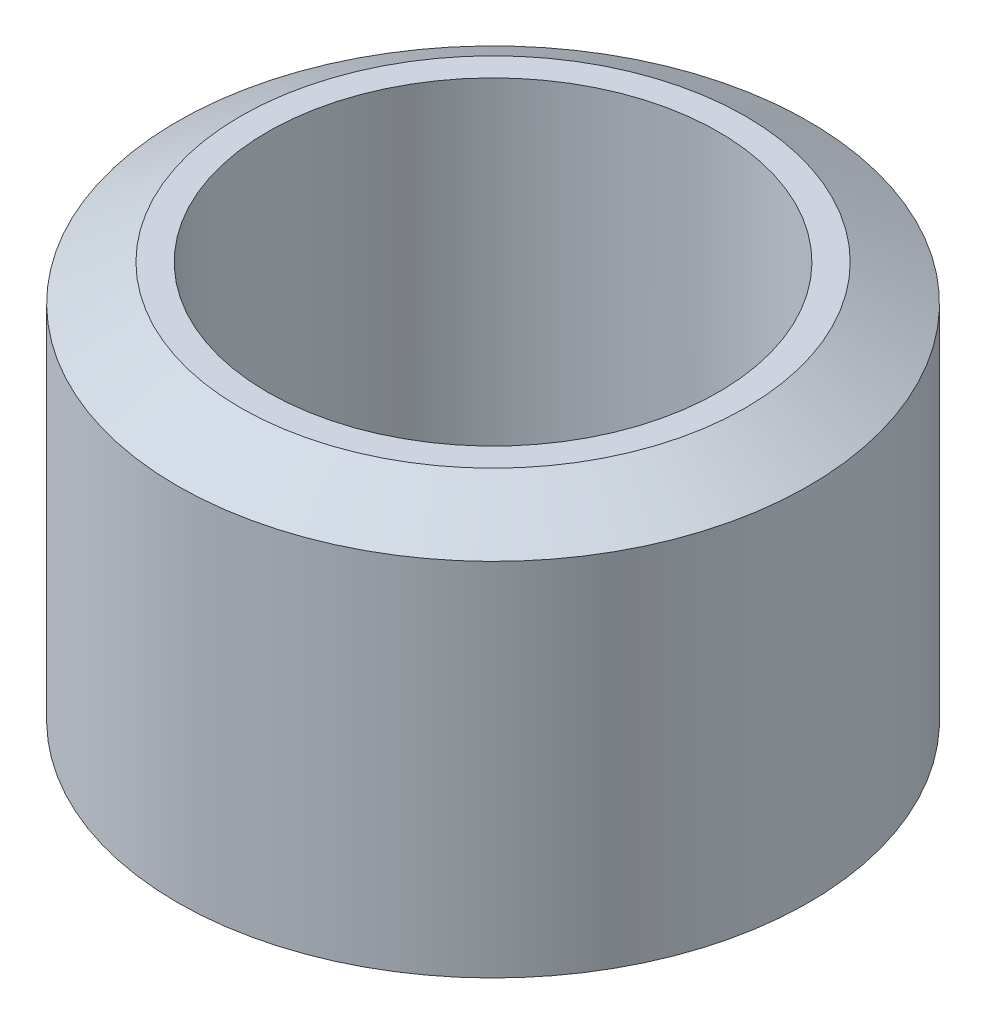
ISO-10303-21;
HEADER;
FILE_DESCRIPTION(('STEP AP214'),'2;1');
FILE_NAME('part.step','',(''),(''),'','','');
FILE_SCHEMA(('AUTOMOTIVE_DESIGN { 1 0 10303 214 1 1 1 1 }'));
ENDSEC;
DATA;
#1=APPLICATION_CONTEXT('core data for automotive mechanical design processes');
#2=APPLICATION_PROTOCOL_DEFINITION('international standard','automotive_design',2000,#1);
#3=PRODUCT_CONTEXT('',#1,'mechanical');
#4=PRODUCT('Part','Part','',(#3));
#5=PRODUCT_RELATED_PRODUCT_CATEGORY('part','',(#4));
#6=PRODUCT_DEFINITION_FORMATION('','',#4);
#7=PRODUCT_DEFINITION_CONTEXT('part definition',#1,'design');
#8=PRODUCT_DEFINITION('design','',#6,#7);
#9=PRODUCT_DEFINITION_SHAPE('','',#8);
#10=(LENGTH_UNIT() NAMED_UNIT(*) SI_UNIT(.MILLI.,.METRE.));
#11=(NAMED_UNIT(*) PLANE_ANGLE_UNIT() SI_UNIT($,.RADIAN.));
#12=(NAMED_UNIT(*) SI_UNIT($,.STERADIAN.) SOLID_ANGLE_UNIT());
#13=UNCERTAINTY_MEASURE_WITH_UNIT(LENGTH_MEASURE(1.E-05),#10,'distance_accuracy_value','');
#14=(GEOMETRIC_REPRESENTATION_CONTEXT(3) GLOBAL_UNCERTAINTY_ASSIGNED_CONTEXT((#13)) GLOBAL_UNIT_ASSIGNED_CONTEXT((#10,
#11,#12)) REPRESENTATION_CONTEXT('',''));
#15=CARTESIAN_POINT('',(0.,0.,0.));
#16=DIRECTION('',(0.,0.,1.));
#17=DIRECTION('',(1.,0.,0.));
#18=AXIS2_PLACEMENT_3D('',#15,#16,#17);
#19=CARTESIAN_POINT('',(0.,10.,0.));
#20=DIRECTION('',(0.,-1.,0.));
#21=DIRECTION('',(0.,0.,-1.));
#22=AXIS2_PLACEMENT_3D('',#19,#20,#21);
#23=CYLINDRICAL_SURFACE('',#22,8.75);
#24=CARTESIAN_POINT('',(0.,10.,0.));
#25=DIRECTION('',(0.,1.,0.));
#26=DIRECTION('',(0.,0.,1.));
#27=AXIS2_PLACEMENT_3D('',#24,#25,#26);
#28=CIRCLE('',#27,8.75);
#29=CARTESIAN_POINT('',(0.,10.,8.75));
#30=VERTEX_POINT('',#29);
#31=EDGE_CURVE('E10',#30,#30,#28,.T.);
#32=ORIENTED_EDGE('',*,*,#31,.F.);
#33=EDGE_LOOP('',(#32));
#34=FACE_BOUND('',#33,.T.);
#35=CARTESIAN_POINT('',(0.,0.,0.));
#36=DIRECTION('',(0.,1.,0.));
#37=DIRECTION('',(0.,0.,1.));
#38=AXIS2_PLACEMENT_3D('',#35,#36,#37);
#39=CIRCLE('',#38,8.75);
#40=CARTESIAN_POINT('',(0.,0.,8.75));
#41=VERTEX_POINT('',#40);
#42=EDGE_CURVE('E54',#41,#41,#39,.T.);
#43=ORIENTED_EDGE('',*,*,#42,.T.);
#44=EDGE_LOOP('',(#43));
#45=FACE_BOUND('',#44,.T.);
#46=ADVANCED_FACE('F32',(#34,#45),#23,.T.);
#47=CARTESIAN_POINT('',(0.,-0.000999999999999265,0.));
#48=DIRECTION('',(0.,1.,0.));
#49=DIRECTION('',(0.,0.,1.));
#50=AXIS2_PLACEMENT_3D('',#47,#48,#49);
#51=CYLINDRICAL_SURFACE('',#50,6.25);
#52=CARTESIAN_POINT('',(0.,11.,0.));
#53=DIRECTION('',(0.,1.,0.));
#54=DIRECTION('',(0.,0.,1.));
#55=AXIS2_PLACEMENT_3D('',#52,#53,#54);
#56=CIRCLE('',#55,6.25);
#57=CARTESIAN_POINT('',(0.,11.,6.25));
#58=VERTEX_POINT('',#57);
#59=EDGE_CURVE('E38',#58,#58,#56,.T.);
#60=ORIENTED_EDGE('',*,*,#59,.T.);
#61=EDGE_LOOP('',(#60));
#62=FACE_BOUND('',#61,.T.);
#63=CARTESIAN_POINT('',(0.,-1.,0.));
#64=DIRECTION('',(0.,-1.,0.));
#65=DIRECTION('',(0.,0.,-1.));
#66=AXIS2_PLACEMENT_3D('',#63,#64,#65);
#67=CIRCLE('',#66,6.25);
#68=CARTESIAN_POINT('',(0.,-1.,-6.25));
#69=VERTEX_POINT('',#68);
#70=EDGE_CURVE('E42',#69,#69,#67,.T.);
#71=ORIENTED_EDGE('',*,*,#70,.T.);
#72=EDGE_LOOP('',(#71));
#73=FACE_BOUND('',#72,.T.);
#74=ADVANCED_FACE('F70',(#62,#73),#51,.F.);
#75=CARTESIAN_POINT('',(0.,11.,0.));
#76=DIRECTION('',(0.,1.,0.));
#77=DIRECTION('',(0.,0.,1.));
#78=AXIS2_PLACEMENT_3D('',#75,#76,#77);
#79=PLANE('',#78);
#80=CARTESIAN_POINT('',(0.,11.,0.));
#81=DIRECTION('',(0.,1.,0.));
#82=DIRECTION('',(0.,0.,1.));
#83=AXIS2_PLACEMENT_3D('',#80,#81,#82);
#84=CIRCLE('',#83,7.);
#85=CARTESIAN_POINT('',(0.,11.,7.));
#86=VERTEX_POINT('',#85);
#87=EDGE_CURVE('E46',#86,#86,#84,.T.);
#88=ORIENTED_EDGE('',*,*,#87,.T.);
#89=EDGE_LOOP('',(#88));
#90=FACE_BOUND('',#89,.T.);
#91=ORIENTED_EDGE('',*,*,#59,.F.);
#92=EDGE_LOOP('',(#91));
#93=FACE_BOUND('',#92,.T.);
#94=ADVANCED_FACE('F75',(#90,#93),#79,.T.);
#95=CARTESIAN_POINT('',(0.,-1.,0.));
#96=DIRECTION('',(0.,-1.,0.));
#97=DIRECTION('',(0.,0.,-1.));
#98=AXIS2_PLACEMENT_3D('',#95,#96,#97);
#99=PLANE('',#98);
#100=CARTESIAN_POINT('',(0.,-0.999999999999999,0.));
#101=DIRECTION('',(0.,1.,0.));
#102=DIRECTION('',(0.,0.,1.));
#103=AXIS2_PLACEMENT_3D('',#100,#101,#102);
#104=CIRCLE('',#103,7.);
#105=CARTESIAN_POINT('',(0.,-0.999999999999999,7.));
#106=VERTEX_POINT('',#105);
#107=EDGE_CURVE('E51',#106,#106,#104,.T.);
#108=ORIENTED_EDGE('',*,*,#107,.F.);
#109=EDGE_LOOP('',(#108));
#110=FACE_BOUND('',#109,.T.);
#111=ORIENTED_EDGE('',*,*,#70,.F.);
#112=EDGE_LOOP('',(#111));
#113=FACE_BOUND('',#112,.T.);
#114=ADVANCED_FACE('F67',(#110,#113),#99,.T.);
#115=CARTESIAN_POINT('',(0.,11.,0.));
#116=DIRECTION('',(0.,-1.,0.));
#117=DIRECTION('',(0.,0.,-1.));
#118=AXIS2_PLACEMENT_3D('',#115,#116,#117);
#119=CONICAL_SURFACE('',#118,7.,1.05165021254837);
#120=ORIENTED_EDGE('',*,*,#31,.T.);
#121=EDGE_LOOP('',(#120));
#122=FACE_BOUND('',#121,.T.);
#123=ORIENTED_EDGE('',*,*,#87,.F.);
#124=EDGE_LOOP('',(#123));
#125=FACE_BOUND('',#124,.T.);
#126=ADVANCED_FACE('F61',(#122,#125),#119,.T.);
#127=CARTESIAN_POINT('',(0.,0.,0.));
#128=DIRECTION('',(0.,1.,0.));
#129=DIRECTION('',(0.,0.,1.));
#130=AXIS2_PLACEMENT_3D('',#127,#128,#129);
#131=CONICAL_SURFACE('',#130,8.75,1.05165021254837);
#132=ORIENTED_EDGE('',*,*,#107,.T.);
#133=EDGE_LOOP('',(#132));
#134=FACE_BOUND('',#133,.T.);
#135=ORIENTED_EDGE('',*,*,#42,.F.);
#136=EDGE_LOOP('',(#135));
#137=FACE_BOUND('',#136,.T.);
#138=ADVANCED_FACE('F59',(#134,#137),#131,.T.);
#139=CLOSED_SHELL('',(#46,#74,#94,#114,#126,#138));
#140=MANIFOLD_SOLID_BREP('B2',#139);
#141=ADVANCED_BREP_SHAPE_REPRESENTATION('',(#18,#140),#14);
#142=SHAPE_DEFINITION_REPRESENTATION(#9,#141);
ENDSEC;
END-ISO-10303-21;
